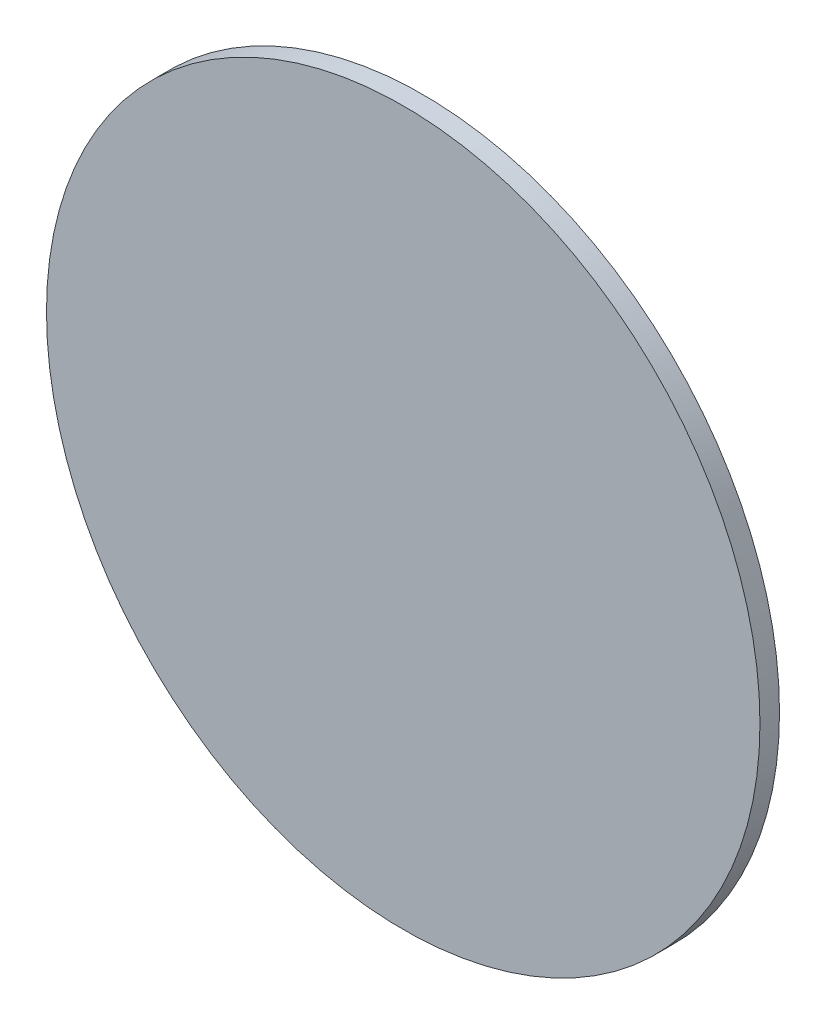
ISO-10303-21;
HEADER;
FILE_DESCRIPTION(('STEP AP214'),'2;1');
FILE_NAME('part.step','',(''),(''),'','','');
FILE_SCHEMA(('AUTOMOTIVE_DESIGN { 1 0 10303 214 1 1 1 1 }'));
ENDSEC;
DATA;
#1=APPLICATION_CONTEXT('core data for automotive mechanical design processes');
#2=APPLICATION_PROTOCOL_DEFINITION('international standard','automotive_design',2000,#1);
#3=PRODUCT_CONTEXT('',#1,'mechanical');
#4=PRODUCT('Part','Part','',(#3));
#5=PRODUCT_RELATED_PRODUCT_CATEGORY('part','',(#4));
#6=PRODUCT_DEFINITION_FORMATION('','',#4);
#7=PRODUCT_DEFINITION_CONTEXT('part definition',#1,'design');
#8=PRODUCT_DEFINITION('design','',#6,#7);
#9=PRODUCT_DEFINITION_SHAPE('','',#8);
#10=(LENGTH_UNIT() NAMED_UNIT(*) SI_UNIT(.MILLI.,.METRE.));
#11=(NAMED_UNIT(*) PLANE_ANGLE_UNIT() SI_UNIT($,.RADIAN.));
#12=(NAMED_UNIT(*) SI_UNIT($,.STERADIAN.) SOLID_ANGLE_UNIT());
#13=UNCERTAINTY_MEASURE_WITH_UNIT(LENGTH_MEASURE(1.E-05),#10,'distance_accuracy_value','');
#14=(GEOMETRIC_REPRESENTATION_CONTEXT(3) GLOBAL_UNCERTAINTY_ASSIGNED_CONTEXT((#13)) GLOBAL_UNIT_ASSIGNED_CONTEXT((#10,
#11,#12)) REPRESENTATION_CONTEXT('',''));
#15=CARTESIAN_POINT('',(0.,0.,0.));
#16=DIRECTION('',(0.,0.,1.));
#17=DIRECTION('',(1.,0.,0.));
#18=AXIS2_PLACEMENT_3D('',#15,#16,#17);
#19=CARTESIAN_POINT('',(0.,0.,2.));
#20=DIRECTION('',(0.,0.,-1.));
#21=DIRECTION('',(-1.,0.,0.));
#22=AXIS2_PLACEMENT_3D('',#19,#20,#21);
#23=CYLINDRICAL_SURFACE('',#22,36.5);
#24=CARTESIAN_POINT('',(0.,0.,2.));
#25=DIRECTION('',(0.,0.,1.));
#26=DIRECTION('',(1.,0.,0.));
#27=AXIS2_PLACEMENT_3D('',#24,#25,#26);
#28=CIRCLE('',#27,36.5);
#29=CARTESIAN_POINT('',(36.5,0.,2.));
#30=VERTEX_POINT('',#29);
#31=EDGE_CURVE('E10',#30,#30,#28,.T.);
#32=ORIENTED_EDGE('',*,*,#31,.F.);
#33=EDGE_LOOP('',(#32));
#34=FACE_BOUND('',#33,.T.);
#35=CARTESIAN_POINT('',(0.,0.,0.));
#36=DIRECTION('',(0.,0.,1.));
#37=DIRECTION('',(1.,0.,0.));
#38=AXIS2_PLACEMENT_3D('',#35,#36,#37);
#39=CIRCLE('',#38,36.5);
#40=CARTESIAN_POINT('',(36.5,0.,0.));
#41=VERTEX_POINT('',#40);
#42=EDGE_CURVE('E34',#41,#41,#39,.T.);
#43=ORIENTED_EDGE('',*,*,#42,.T.);
#44=EDGE_LOOP('',(#43));
#45=FACE_BOUND('',#44,.T.);
#46=ADVANCED_FACE('F31',(#34,#45),#23,.T.);
#47=CARTESIAN_POINT('',(0.,0.,2.));
#48=DIRECTION('',(0.,0.,1.));
#49=DIRECTION('',(1.,0.,0.));
#50=AXIS2_PLACEMENT_3D('',#47,#48,#49);
#51=PLANE('',#50);
#52=ORIENTED_EDGE('',*,*,#31,.T.);
#53=EDGE_LOOP('',(#52));
#54=FACE_BOUND('',#53,.T.);
#55=ADVANCED_FACE('F46',(#54),#51,.T.);
#56=CARTESIAN_POINT('',(0.,0.,0.));
#57=DIRECTION('',(0.,0.,1.));
#58=DIRECTION('',(1.,0.,0.));
#59=AXIS2_PLACEMENT_3D('',#56,#57,#58);
#60=PLANE('',#59);
#61=ORIENTED_EDGE('',*,*,#42,.F.);
#62=EDGE_LOOP('',(#61));
#63=FACE_BOUND('',#62,.T.);
#64=ADVANCED_FACE('F44',(#63),#60,.F.);
#65=CLOSED_SHELL('',(#46,#55,#64));
#66=MANIFOLD_SOLID_BREP('B2',#65);
#67=ADVANCED_BREP_SHAPE_REPRESENTATION('',(#18,#66),#14);
#68=SHAPE_DEFINITION_REPRESENTATION(#9,#67);
ENDSEC;
END-ISO-10303-21;
